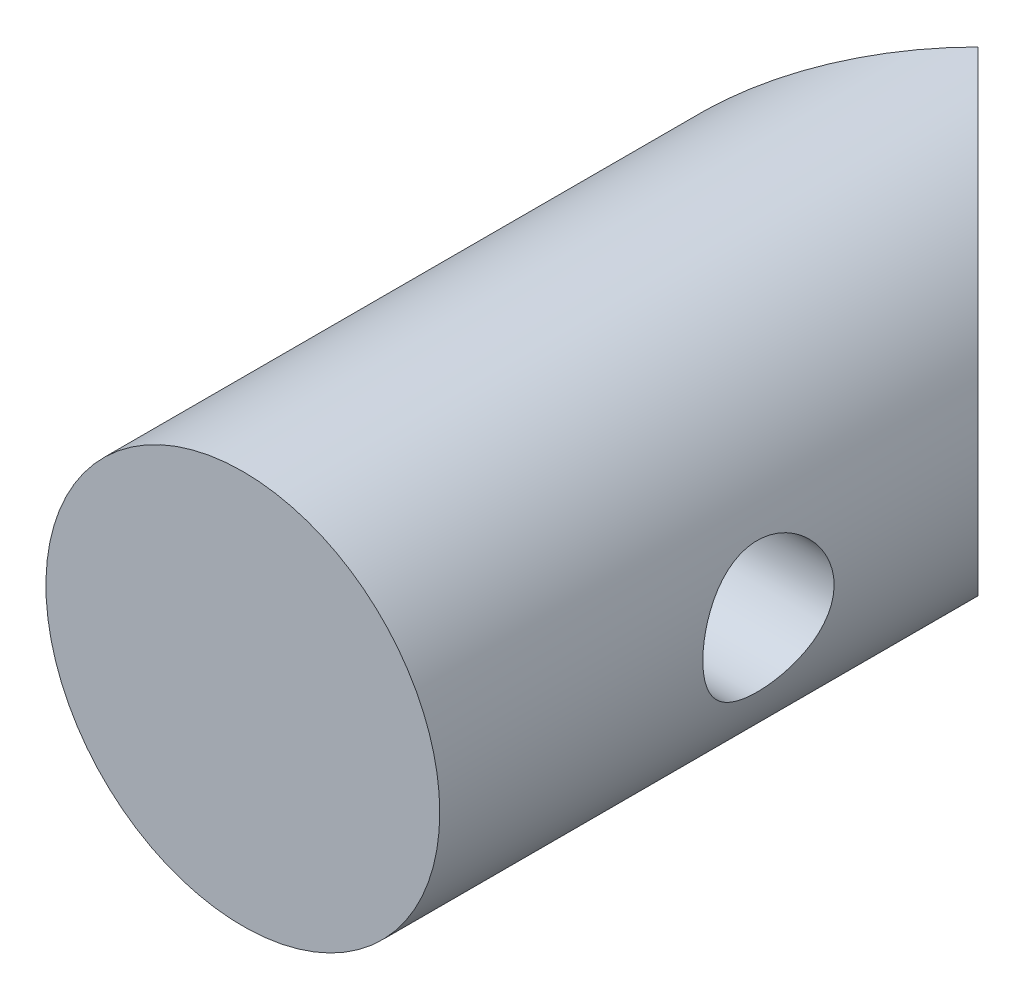
ISO-10303-21;
HEADER;
FILE_DESCRIPTION(('STEP AP214'),'2;1');
FILE_NAME('part.step','',(''),(''),'','','');
FILE_SCHEMA(('AUTOMOTIVE_DESIGN { 1 0 10303 214 1 1 1 1 }'));
ENDSEC;
DATA;
#1=APPLICATION_CONTEXT('core data for automotive mechanical design processes');
#2=APPLICATION_PROTOCOL_DEFINITION('international standard','automotive_design',2000,#1);
#3=PRODUCT_CONTEXT('',#1,'mechanical');
#4=PRODUCT('Part','Part','',(#3));
#5=PRODUCT_RELATED_PRODUCT_CATEGORY('part','',(#4));
#6=PRODUCT_DEFINITION_FORMATION('','',#4);
#7=PRODUCT_DEFINITION_CONTEXT('part definition',#1,'design');
#8=PRODUCT_DEFINITION('design','',#6,#7);
#9=PRODUCT_DEFINITION_SHAPE('','',#8);
#10=(LENGTH_UNIT() NAMED_UNIT(*) SI_UNIT(.MILLI.,.METRE.));
#11=(NAMED_UNIT(*) PLANE_ANGLE_UNIT() SI_UNIT($,.RADIAN.));
#12=(NAMED_UNIT(*) SI_UNIT($,.STERADIAN.) SOLID_ANGLE_UNIT());
#13=UNCERTAINTY_MEASURE_WITH_UNIT(LENGTH_MEASURE(1.E-05),#10,'distance_accuracy_value','');
#14=(GEOMETRIC_REPRESENTATION_CONTEXT(3) GLOBAL_UNCERTAINTY_ASSIGNED_CONTEXT((#13)) GLOBAL_UNIT_ASSIGNED_CONTEXT((#10,
#11,#12)) REPRESENTATION_CONTEXT('',''));
#15=CARTESIAN_POINT('',(0.,0.,0.));
#16=DIRECTION('',(0.,0.,1.));
#17=DIRECTION('',(1.,0.,0.));
#18=AXIS2_PLACEMENT_3D('',#15,#16,#17);
#19=CARTESIAN_POINT('',(0.,0.,17.78));
#20=DIRECTION('',(0.,0.,-1.));
#21=DIRECTION('',(-1.,0.,0.));
#22=AXIS2_PLACEMENT_3D('',#19,#20,#21);
#23=CYLINDRICAL_SURFACE('',#22,4.7625);
#24=CARTESIAN_POINT('',(4.7625,0.,11.4173));
#25=CARTESIAN_POINT('',(4.76250024290249,0.0866193385826715,11.417300402799));
#26=CARTESIAN_POINT('',(4.76011509093227,0.173236246329946,11.410187577523));
#27=CARTESIAN_POINT('',(4.75083521197708,0.343918795385841,11.3820112897527));
#28=CARTESIAN_POINT('',(4.74394001683417,0.42798417088862,11.3609463789811));
#29=CARTESIAN_POINT('',(4.72638926301478,0.591078303334066,11.3056682011278));
#30=CARTESIAN_POINT('',(4.7157399927273,0.670115223594075,11.2714769133459));
#31=CARTESIAN_POINT('',(4.6917680757628,0.821332712178448,11.1910158881191));
#32=CARTESIAN_POINT('',(4.67844490185098,0.89351192417194,11.1447437680584));
#33=CARTESIAN_POINT('',(4.65001124928271,1.03146490909784,11.0397515347867));
#34=CARTESIAN_POINT('',(4.63485795886259,1.09696837422356,10.9806879156115));
#35=CARTESIAN_POINT('',(4.60470749718205,1.21734689966455,10.8525196419033));
#36=CARTESIAN_POINT('',(4.58971036098747,1.27221961946451,10.783412782051));
#37=CARTESIAN_POINT('',(4.56109915307672,1.37132209578672,10.6346861296256));
#38=CARTESIAN_POINT('',(4.54753724850155,1.41520046242588,10.5548211881753));
#39=CARTESIAN_POINT('',(4.52398297352029,1.48878746228087,10.3883204500471));
#40=CARTESIAN_POINT('',(4.51398951405184,1.51850041960148,10.3016867290041));
#41=CARTESIAN_POINT('',(4.49915443940137,1.56189912014579,10.127181260874));
#42=CARTESIAN_POINT('',(4.49415052034258,1.57609134913143,10.0394496815236));
#43=CARTESIAN_POINT('',(4.48938104899343,1.58962903329347,9.86271879027754));
#44=CARTESIAN_POINT('',(4.48961387798584,1.58897907629748,9.77371987862416));
#45=CARTESIAN_POINT('',(4.49514936325486,1.57324409712917,9.60130059917012));
#46=CARTESIAN_POINT('',(4.50021985189709,1.5588200871526,9.51781116036606));
#47=CARTESIAN_POINT('',(4.51447944137725,1.51702478352344,9.35451294637415));
#48=CARTESIAN_POINT('',(4.52366903532271,1.48965193971459,9.27470461312183));
#49=CARTESIAN_POINT('',(4.54529683920858,1.42230325467058,9.11953226002353));
#50=CARTESIAN_POINT('',(4.55778498196574,1.38213155232277,9.04426050956713));
#51=CARTESIAN_POINT('',(4.58458186738966,1.29046145625623,8.90131743310594));
#52=CARTESIAN_POINT('',(4.59889113542361,1.23895979087785,8.83364831099326));
#53=CARTESIAN_POINT('',(4.62863135053789,1.12291706563304,8.70411708791978));
#54=CARTESIAN_POINT('',(4.64408185600813,1.05783562574614,8.64274259746686));
#55=CARTESIAN_POINT('',(4.67371014689421,0.918114067327471,8.53165161417186));
#56=CARTESIAN_POINT('',(4.68788781016682,0.843473033111538,8.48193623941387));
#57=CARTESIAN_POINT('',(4.71355908851247,0.685716835710946,8.39518212337684));
#58=CARTESIAN_POINT('',(4.72502468137762,0.602524951310931,8.3582740324966));
#59=CARTESIAN_POINT('',(4.7437765034179,0.430639669841152,8.29912746134531));
#60=CARTESIAN_POINT('',(4.75106418427121,0.341948195570986,8.2768838852653));
#61=CARTESIAN_POINT('',(4.76039857975912,0.165709329377767,8.24856163018951));
#62=CARTESIAN_POINT('',(4.76265877911043,0.0782789897854404,8.24182405293826));
#63=CARTESIAN_POINT('',(4.76232383028038,-0.0964804235618789,8.24282811933758));
#64=CARTESIAN_POINT('',(4.75972950165738,-0.183809511919947,8.25056731896806));
#65=CARTESIAN_POINT('',(4.75011789238403,-0.353250287758007,8.27978390353084));
#66=CARTESIAN_POINT('',(4.74323090454018,-0.435439830850315,8.30085685210358));
#67=CARTESIAN_POINT('',(4.72585806842736,-0.595083834245073,8.35563709309094));
#68=CARTESIAN_POINT('',(4.71537176124097,-0.672537689257412,8.38934599665512));
#69=CARTESIAN_POINT('',(4.69152178418573,-0.82278267052432,8.46942431054725));
#70=CARTESIAN_POINT('',(4.6780896842481,-0.895397560257219,8.51610341683704));
#71=CARTESIAN_POINT('',(4.64987090592067,-1.03197791784024,8.62043321314641));
#72=CARTESIAN_POINT('',(4.63508381455201,-1.09594073387548,8.67808725395043));
#73=CARTESIAN_POINT('',(4.60496996168956,-1.2164258561425,8.80582876722296));
#74=CARTESIAN_POINT('',(4.58964920726292,-1.27247803867766,8.87636214774639));
#75=CARTESIAN_POINT('',(4.5608870760535,-1.37200881668867,9.02616236389979));
#76=CARTESIAN_POINT('',(4.54744571493929,-1.41548730734048,9.1054292723316));
#77=CARTESIAN_POINT('',(4.52409546968821,-1.48843512703597,9.27048091177271));
#78=CARTESIAN_POINT('',(4.51417945258854,-1.51793278481197,9.35625205068042));
#79=CARTESIAN_POINT('',(4.49914696286489,-1.56193278348047,9.53195110694506));
#80=CARTESIAN_POINT('',(4.49402832815028,-1.57644187973937,9.62187713257941));
#81=CARTESIAN_POINT('',(4.48941600962756,-1.58952609843277,9.79836288996496));
#82=CARTESIAN_POINT('',(4.48964685408647,-1.58888153347708,9.88485821520533));
#83=CARTESIAN_POINT('',(4.4950264084539,-1.57359714084979,10.0564395564388));
#84=CARTESIAN_POINT('',(4.50017482566362,-1.5589581461405,10.1415256560037));
#85=CARTESIAN_POINT('',(4.51460432334016,-1.51665275334283,10.3062653650164));
#86=CARTESIAN_POINT('',(4.52380505610683,-1.48923906179962,10.3859914596946));
#87=CARTESIAN_POINT('',(4.54527283124319,-1.42236724314359,10.5397735085145));
#88=CARTESIAN_POINT('',(4.55754055411887,-1.38290644257916,10.613828199511));
#89=CARTESIAN_POINT('',(4.58442741396348,-1.29105134947619,10.7576678260026));
#90=CARTESIAN_POINT('',(4.59912579731893,-1.23816783538877,10.8271254467637));
#91=CARTESIAN_POINT('',(4.62888578099664,-1.12179557697784,10.9564325787474));
#92=CARTESIAN_POINT('',(4.64394748298391,-1.05830383406672,11.0162793639048));
#93=CARTESIAN_POINT('',(4.67344173459301,-0.919545971611588,11.1270167545091));
#94=CARTESIAN_POINT('',(4.68782688609495,-0.843917402680816,11.1774674020547));
#95=CARTESIAN_POINT('',(4.71370010986521,-0.684779804883015,11.2648848058004));
#96=CARTESIAN_POINT('',(4.72518892253839,-0.601272797535101,11.3018550091512));
#97=CARTESIAN_POINT('',(4.7435375517131,-0.432583664931547,11.3597080915758));
#98=CARTESIAN_POINT('',(4.75058124720755,-0.347643065311297,11.3812359151931));
#99=CARTESIAN_POINT('',(4.76006171214452,-0.175133660416267,11.4100296955749));
#100=CARTESIAN_POINT('',(4.76249975444399,-0.0875655880903853,11.4172995928007));
#101=CARTESIAN_POINT('',(4.7625,0.,11.4173));
#102=B_SPLINE_CURVE_WITH_KNOTS('',3,(#24,#25,#26,#27,#28,#29,#30,#31,#32,#33,#34,#35,#36,#37,
#38,#39,#40,#41,#42,#43,#44,#45,#46,#47,#48,#49,#50,#51,#52,#53,#54,#55,#56,#57,#58,#59,#60,#61,
#62,#63,#64,#65,#66,#67,#68,#69,#70,#71,#72,#73,#74,#75,#76,#77,#78,#79,#80,#81,#82,#83,#84,#85,
#86,#87,#88,#89,#90,#91,#92,#93,#94,#95,#96,#97,#98,#99,#100,#101),.UNSPECIFIED.,.T.,.F.,(4,2,2,
2,2,2,2,2,2,2,2,2,2,2,2,2,2,2,2,2,2,2,2,2,2,2,2,2,2,2,2,2,2,2,2,2,2,2,4),(0.,0.259535780816291,
0.519098506612187,0.778228493181556,1.03740962475607,1.30468186298875,1.57201287843953,
1.84703060907258,2.12196433449872,2.3876305711517,2.65321468955132,2.90666212150156,
3.16013990233076,3.41769971708769,3.67533400311153,3.94641872975543,4.21752944222005,
4.49132968969941,4.76503474342566,5.0268756329058,5.28867232148128,5.54288575790412,
5.79713161888512,6.05806509751929,6.3190783705475,6.59195123823191,6.86482638073054,
7.13714621949995,7.40934326970518,7.66755619877007,7.92575375970305,8.17904744490159,
8.43239738104361,8.69680230873236,8.96128210158995,9.23606961575718,9.5107868132952,
9.77323036418425,10.0356013733554),.UNSPECIFIED.);
#103=CARTESIAN_POINT('',(4.7625,0.,11.4173));
#104=VERTEX_POINT('',#103);
#105=EDGE_CURVE('E11',#104,#104,#102,.T.);
#106=ORIENTED_EDGE('',*,*,#105,.T.);
#107=EDGE_LOOP('',(#106));
#108=FACE_BOUND('',#107,.T.);
#109=CARTESIAN_POINT('',(-4.7625,0.,11.4173));
#110=CARTESIAN_POINT('',(-4.76250024290249,-0.0866193385826728,11.417300402799));
#111=CARTESIAN_POINT('',(-4.76011509093227,-0.173236246329947,11.410187577523));
#112=CARTESIAN_POINT('',(-4.75083521197708,-0.343918795385842,11.3820112897527));
#113=CARTESIAN_POINT('',(-4.74394001683417,-0.427984170888621,11.3609463789811));
#114=CARTESIAN_POINT('',(-4.72638926301478,-0.591078303334067,11.3056682011278));
#115=CARTESIAN_POINT('',(-4.7157399927273,-0.670115223594077,11.2714769133459));
#116=CARTESIAN_POINT('',(-4.6917680757628,-0.82133271217845,11.1910158881191));
#117=CARTESIAN_POINT('',(-4.67844490185098,-0.893511924171942,11.1447437680584));
#118=CARTESIAN_POINT('',(-4.65001124928271,-1.03146490909784,11.0397515347867));
#119=CARTESIAN_POINT('',(-4.63485795886259,-1.09696837422356,10.9806879156115));
#120=CARTESIAN_POINT('',(-4.60470749718205,-1.21734689966455,10.8525196419033));
#121=CARTESIAN_POINT('',(-4.58971036098747,-1.27221961946452,10.783412782051));
#122=CARTESIAN_POINT('',(-4.56109915307672,-1.37132209578672,10.6346861296256));
#123=CARTESIAN_POINT('',(-4.54753724850155,-1.41520046242588,10.5548211881753));
#124=CARTESIAN_POINT('',(-4.52398297352029,-1.48878746228088,10.3883204500471));
#125=CARTESIAN_POINT('',(-4.51398951405184,-1.51850041960148,10.3016867290041));
#126=CARTESIAN_POINT('',(-4.49915443940136,-1.56189912014579,10.127181260874));
#127=CARTESIAN_POINT('',(-4.49415052034258,-1.57609134913143,10.0394496815236));
#128=CARTESIAN_POINT('',(-4.48938104899343,-1.58962903329348,9.86271879027754));
#129=CARTESIAN_POINT('',(-4.48961387798584,-1.58897907629748,9.77371987862416));
#130=CARTESIAN_POINT('',(-4.49514936325486,-1.57324409712917,9.60130059917012));
#131=CARTESIAN_POINT('',(-4.50021985189709,-1.5588200871526,9.51781116036606));
#132=CARTESIAN_POINT('',(-4.51447944137725,-1.51702478352344,9.35451294637415));
#133=CARTESIAN_POINT('',(-4.52366903532271,-1.48965193971459,9.27470461312183));
#134=CARTESIAN_POINT('',(-4.54529683920858,-1.42230325467058,9.11953226002353));
#135=CARTESIAN_POINT('',(-4.55778498196574,-1.38213155232277,9.04426050956713));
#136=CARTESIAN_POINT('',(-4.58458186738966,-1.29046145625623,8.90131743310594));
#137=CARTESIAN_POINT('',(-4.59889113542361,-1.23895979087785,8.83364831099326));
#138=CARTESIAN_POINT('',(-4.62863135053789,-1.12291706563305,8.70411708791978));
#139=CARTESIAN_POINT('',(-4.64408185600813,-1.05783562574614,8.64274259746686));
#140=CARTESIAN_POINT('',(-4.67371014689421,-0.918114067327473,8.53165161417186));
#141=CARTESIAN_POINT('',(-4.68788781016682,-0.84347303311154,8.48193623941387));
#142=CARTESIAN_POINT('',(-4.71355908851247,-0.685716835710948,8.39518212337683));
#143=CARTESIAN_POINT('',(-4.72502468137762,-0.602524951310932,8.3582740324966));
#144=CARTESIAN_POINT('',(-4.7437765034179,-0.430639669841154,8.29912746134532));
#145=CARTESIAN_POINT('',(-4.75106418427121,-0.341948195570989,8.2768838852653));
#146=CARTESIAN_POINT('',(-4.76039857975912,-0.165709329377771,8.24856163018951));
#147=CARTESIAN_POINT('',(-4.76265877911043,-0.0782789897854451,8.24182405293826));
#148=CARTESIAN_POINT('',(-4.76232383028038,0.0964804235618743,8.24282811933758));
#149=CARTESIAN_POINT('',(-4.75972950165738,0.183809511919942,8.25056731896806));
#150=CARTESIAN_POINT('',(-4.75011789238403,0.353250287758002,8.27978390353084));
#151=CARTESIAN_POINT('',(-4.74323090454018,0.43543983085031,8.30085685210358));
#152=CARTESIAN_POINT('',(-4.72585806842736,0.595083834245069,8.35563709309094));
#153=CARTESIAN_POINT('',(-4.71537176124097,0.672537689257408,8.38934599665512));
#154=CARTESIAN_POINT('',(-4.69152178418573,0.822782670524316,8.46942431054725));
#155=CARTESIAN_POINT('',(-4.6780896842481,0.895397560257216,8.51610341683704));
#156=CARTESIAN_POINT('',(-4.64987090592067,1.03197791784024,8.62043321314641));
#157=CARTESIAN_POINT('',(-4.63508381455201,1.09594073387547,8.67808725395043));
#158=CARTESIAN_POINT('',(-4.60496996168956,1.21642585614249,8.80582876722296));
#159=CARTESIAN_POINT('',(-4.58964920726292,1.27247803867765,8.87636214774639));
#160=CARTESIAN_POINT('',(-4.5608870760535,1.37200881668867,9.02616236389979));
#161=CARTESIAN_POINT('',(-4.54744571493929,1.41548730734048,9.1054292723316));
#162=CARTESIAN_POINT('',(-4.52409546968821,1.48843512703597,9.27048091177271));
#163=CARTESIAN_POINT('',(-4.51417945258854,1.51793278481196,9.35625205068042));
#164=CARTESIAN_POINT('',(-4.49914696286489,1.56193278348047,9.53195110694506));
#165=CARTESIAN_POINT('',(-4.49402832815028,1.57644187973937,9.62187713257941));
#166=CARTESIAN_POINT('',(-4.48941600962756,1.58952609843277,9.79836288996496));
#167=CARTESIAN_POINT('',(-4.48964685408647,1.58888153347708,9.88485821520533));
#168=CARTESIAN_POINT('',(-4.4950264084539,1.57359714084979,10.0564395564388));
#169=CARTESIAN_POINT('',(-4.50017482566362,1.5589581461405,10.1415256560037));
#170=CARTESIAN_POINT('',(-4.51460432334016,1.51665275334283,10.3062653650164));
#171=CARTESIAN_POINT('',(-4.52380505610683,1.48923906179962,10.3859914596946));
#172=CARTESIAN_POINT('',(-4.54527283124319,1.42236724314359,10.5397735085145));
#173=CARTESIAN_POINT('',(-4.55754055411887,1.38290644257916,10.613828199511));
#174=CARTESIAN_POINT('',(-4.58442741396349,1.29105134947619,10.7576678260026));
#175=CARTESIAN_POINT('',(-4.59912579731893,1.23816783538877,10.8271254467637));
#176=CARTESIAN_POINT('',(-4.62888578099664,1.12179557697784,10.9564325787474));
#177=CARTESIAN_POINT('',(-4.64394748298391,1.05830383406672,11.0162793639048));
#178=CARTESIAN_POINT('',(-4.67344173459301,0.919545971611587,11.1270167545091));
#179=CARTESIAN_POINT('',(-4.68782688609495,0.843917402680814,11.1774674020547));
#180=CARTESIAN_POINT('',(-4.71370010986522,0.684779804883012,11.2648848058004));
#181=CARTESIAN_POINT('',(-4.72518892253839,0.601272797535099,11.3018550091512));
#182=CARTESIAN_POINT('',(-4.7435375517131,0.432583664931546,11.3597080915758));
#183=CARTESIAN_POINT('',(-4.75058124720755,0.347643065311296,11.3812359151931));
#184=CARTESIAN_POINT('',(-4.76006171214452,0.175133660416266,11.4100296955749));
#185=CARTESIAN_POINT('',(-4.76249975444399,0.0875655880903841,11.4172995928007));
#186=CARTESIAN_POINT('',(-4.7625,0.,11.4173));
#187=B_SPLINE_CURVE_WITH_KNOTS('',3,(#109,#110,#111,#112,#113,#114,#115,#116,#117,#118,#119,
#120,#121,#122,#123,#124,#125,#126,#127,#128,#129,#130,#131,#132,#133,#134,#135,#136,#137,#138,
#139,#140,#141,#142,#143,#144,#145,#146,#147,#148,#149,#150,#151,#152,#153,#154,#155,#156,#157,
#158,#159,#160,#161,#162,#163,#164,#165,#166,#167,#168,#169,#170,#171,#172,#173,#174,#175,#176,
#177,#178,#179,#180,#181,#182,#183,#184,#185,#186),.UNSPECIFIED.,.T.,.F.,(4,2,2,2,2,2,2,2,2,2,2,
2,2,2,2,2,2,2,2,2,2,2,2,2,2,2,2,2,2,2,2,2,2,2,2,2,2,2,4),(0.,0.259535780816292,
0.519098506612187,0.778228493181557,1.03740962475607,1.30468186298874,1.57201287843954,
1.84703060907259,2.12196433449872,2.3876305711517,2.65321468955132,2.90666212150156,
3.16013990233076,3.41769971708768,3.67533400311152,3.94641872975543,4.21752944222005,
4.49132968969941,4.76503474342566,5.02687563290579,5.28867232148128,5.54288575790411,
5.79713161888512,6.05806509751929,6.3190783705475,6.59195123823191,6.86482638073054,
7.13714621949995,7.40934326970518,7.66755619877007,7.92575375970305,8.17904744490159,
8.43239738104361,8.69680230873236,8.96128210158995,9.23606961575718,9.5107868132952,
9.77323036418425,10.0356013733554),.UNSPECIFIED.);
#188=CARTESIAN_POINT('',(-4.7625,0.,11.4173));
#189=VERTEX_POINT('',#188);
#190=EDGE_CURVE('E53',#189,#189,#187,.T.);
#191=ORIENTED_EDGE('',*,*,#190,.T.);
#192=EDGE_LOOP('',(#191));
#193=FACE_BOUND('',#192,.T.);
#194=CARTESIAN_POINT('',(0.,0.,17.78));
#195=DIRECTION('',(0.,0.,1.));
#196=DIRECTION('',(1.,0.,0.));
#197=AXIS2_PLACEMENT_3D('',#194,#195,#196);
#198=CIRCLE('',#197,4.7625);
#199=CARTESIAN_POINT('',(4.7625,0.,17.78));
#200=VERTEX_POINT('',#199);
#201=EDGE_CURVE('E65',#200,#200,#198,.T.);
#202=ORIENTED_EDGE('',*,*,#201,.F.);
#203=EDGE_LOOP('',(#202));
#204=FACE_BOUND('',#203,.T.);
#205=CARTESIAN_POINT('',(0.,0.,0.));
#206=DIRECTION('',(-0.707106781186549,0.,0.707106781186546));
#207=DIRECTION('',(-0.707106781186546,0.,-0.707106781186549));
#208=AXIS2_PLACEMENT_3D('',#205,#206,#207);
#209=ELLIPSE('',#208,6.73519209080188,4.7625);
#210=CARTESIAN_POINT('',(0.,-4.7625,0.));
#211=VERTEX_POINT('',#210);
#212=CARTESIAN_POINT('',(0.,4.7625,0.));
#213=VERTEX_POINT('',#212);
#214=EDGE_CURVE('E59',#211,#213,#209,.T.);
#215=ORIENTED_EDGE('',*,*,#214,.T.);
#216=CARTESIAN_POINT('',(0.,0.,0.));
#217=DIRECTION('',(0.707106781186549,0.,0.707106781186546));
#218=DIRECTION('',(0.707106781186546,0.,-0.707106781186549));
#219=AXIS2_PLACEMENT_3D('',#216,#217,#218);
#220=ELLIPSE('',#219,6.73519209080188,4.7625);
#221=EDGE_CURVE('E62',#213,#211,#220,.T.);
#222=ORIENTED_EDGE('',*,*,#221,.T.);
#223=EDGE_LOOP('',(#215,#222));
#224=FACE_BOUND('',#223,.T.);
#225=ADVANCED_FACE('F41',(#108,#193,#204,#224),#23,.T.);
#226=CARTESIAN_POINT('',(0.,0.,17.78));
#227=DIRECTION('',(0.,0.,1.));
#228=DIRECTION('',(1.,0.,0.));
#229=AXIS2_PLACEMENT_3D('',#226,#227,#228);
#230=PLANE('',#229);
#231=ORIENTED_EDGE('',*,*,#201,.T.);
#232=EDGE_LOOP('',(#231));
#233=FACE_BOUND('',#232,.T.);
#234=ADVANCED_FACE('F88',(#233),#230,.T.);
#235=CARTESIAN_POINT('',(-4.7625,-4.7625,4.76250000000002));
#236=DIRECTION('',(0.707106781186549,0.,0.707106781186546));
#237=DIRECTION('',(0.707106781186546,0.,-0.707106781186549));
#238=AXIS2_PLACEMENT_3D('',#235,#236,#237);
#239=PLANE('',#238);
#240=DIRECTION('',(0.,1.,0.));
#241=VECTOR('',#240,1.);
#242=CARTESIAN_POINT('',(0.,-4.7625,0.));
#243=LINE('',#242,#241);
#244=EDGE_CURVE('E69',#211,#213,#243,.T.);
#245=ORIENTED_EDGE('',*,*,#244,.F.);
#246=ORIENTED_EDGE('',*,*,#221,.F.);
#247=EDGE_LOOP('',(#245,#246));
#248=FACE_BOUND('',#247,.T.);
#249=ADVANCED_FACE('F71',(#248),#239,.F.);
#250=CARTESIAN_POINT('',(0.,-4.7625,0.));
#251=DIRECTION('',(-0.707106781186549,0.,0.707106781186546));
#252=DIRECTION('',(0.707106781186546,0.,0.707106781186549));
#253=AXIS2_PLACEMENT_3D('',#250,#251,#252);
#254=PLANE('',#253);
#255=ORIENTED_EDGE('',*,*,#244,.T.);
#256=ORIENTED_EDGE('',*,*,#214,.F.);
#257=EDGE_LOOP('',(#255,#256));
#258=FACE_BOUND('',#257,.T.);
#259=ADVANCED_FACE('F68',(#258),#254,.F.);
#260=CARTESIAN_POINT('',(-4.7625,0.,9.8298));
#261=DIRECTION('',(-1.,0.,0.));
#262=DIRECTION('',(0.,0.,1.));
#263=AXIS2_PLACEMENT_3D('',#260,#261,#262);
#264=CYLINDRICAL_SURFACE('',#263,1.58749999999999);
#265=ORIENTED_EDGE('',*,*,#190,.F.);
#266=EDGE_LOOP('',(#265));
#267=FACE_BOUND('',#266,.T.);
#268=ORIENTED_EDGE('',*,*,#105,.F.);
#269=EDGE_LOOP('',(#268));
#270=FACE_BOUND('',#269,.T.);
#271=ADVANCED_FACE('F79',(#267,#270),#264,.F.);
#272=CLOSED_SHELL('',(#225,#234,#249,#259,#271));
#273=MANIFOLD_SOLID_BREP('B2',#272);
#274=ADVANCED_BREP_SHAPE_REPRESENTATION('',(#18,#273),#14);
#275=SHAPE_DEFINITION_REPRESENTATION(#9,#274);
ENDSEC;
END-ISO-10303-21;
